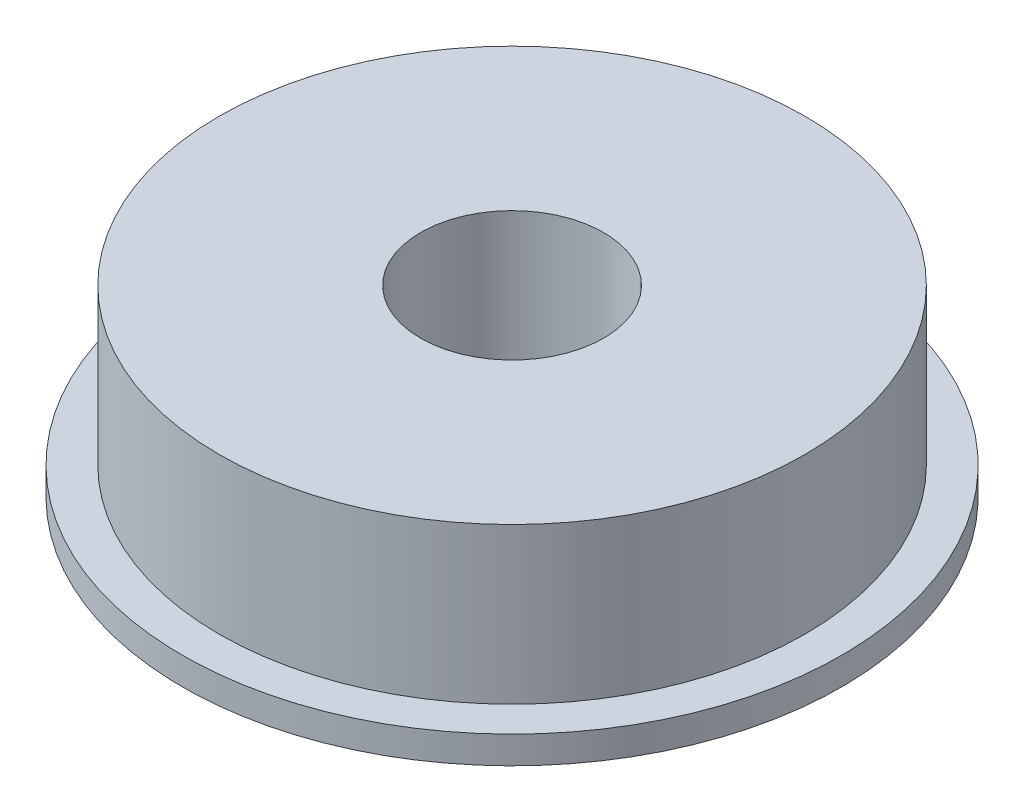
ISO-10303-21;
HEADER;
FILE_DESCRIPTION(('STEP AP214'),'2;1');
FILE_NAME('part.step','',(''),(''),'','','');
FILE_SCHEMA(('AUTOMOTIVE_DESIGN { 1 0 10303 214 1 1 1 1 }'));
ENDSEC;
DATA;
#1=APPLICATION_CONTEXT('core data for automotive mechanical design processes');
#2=APPLICATION_PROTOCOL_DEFINITION('international standard','automotive_design',2000,#1);
#3=PRODUCT_CONTEXT('',#1,'mechanical');
#4=PRODUCT('Part','Part','',(#3));
#5=PRODUCT_RELATED_PRODUCT_CATEGORY('part','',(#4));
#6=PRODUCT_DEFINITION_FORMATION('','',#4);
#7=PRODUCT_DEFINITION_CONTEXT('part definition',#1,'design');
#8=PRODUCT_DEFINITION('design','',#6,#7);
#9=PRODUCT_DEFINITION_SHAPE('','',#8);
#10=(LENGTH_UNIT() NAMED_UNIT(*) SI_UNIT(.MILLI.,.METRE.));
#11=(NAMED_UNIT(*) PLANE_ANGLE_UNIT() SI_UNIT($,.RADIAN.));
#12=(NAMED_UNIT(*) SI_UNIT($,.STERADIAN.) SOLID_ANGLE_UNIT());
#13=UNCERTAINTY_MEASURE_WITH_UNIT(LENGTH_MEASURE(1.E-05),#10,'distance_accuracy_value','');
#14=(GEOMETRIC_REPRESENTATION_CONTEXT(3) GLOBAL_UNCERTAINTY_ASSIGNED_CONTEXT((#13)) GLOBAL_UNIT_ASSIGNED_CONTEXT((#10,
#11,#12)) REPRESENTATION_CONTEXT('',''));
#15=CARTESIAN_POINT('',(0.,0.,0.));
#16=DIRECTION('',(0.,0.,1.));
#17=DIRECTION('',(1.,0.,0.));
#18=AXIS2_PLACEMENT_3D('',#15,#16,#17);
#19=CARTESIAN_POINT('',(0.,0.,-9.00000000000001));
#20=DIRECTION('',(0.,-1.,0.));
#21=DIRECTION('',(0.,0.,-1.));
#22=AXIS2_PLACEMENT_3D('',#19,#20,#21);
#23=PLANE('',#22);
#24=CARTESIAN_POINT('',(0.,0.,0.));
#25=DIRECTION('',(0.,1.,0.));
#26=DIRECTION('',(0.,0.,1.));
#27=AXIS2_PLACEMENT_3D('',#24,#25,#26);
#28=CIRCLE('',#27,2.5);
#29=CARTESIAN_POINT('',(0.,0.,2.5));
#30=VERTEX_POINT('',#29);
#31=EDGE_CURVE('E50',#30,#30,#28,.T.);
#32=ORIENTED_EDGE('',*,*,#31,.T.);
#33=EDGE_LOOP('',(#32));
#34=FACE_BOUND('',#33,.T.);
#35=CARTESIAN_POINT('',(0.,0.,0.));
#36=DIRECTION('',(0.,-1.,0.));
#37=DIRECTION('',(0.,0.,-1.));
#38=AXIS2_PLACEMENT_3D('',#35,#36,#37);
#39=CIRCLE('',#38,9.00000000000001);
#40=CARTESIAN_POINT('',(0.,0.,-9.00000000000001));
#41=VERTEX_POINT('',#40);
#42=EDGE_CURVE('E45',#41,#41,#39,.T.);
#43=ORIENTED_EDGE('',*,*,#42,.T.);
#44=EDGE_LOOP('',(#43));
#45=FACE_BOUND('',#44,.T.);
#46=ADVANCED_FACE('F31',(#34,#45),#23,.T.);
#47=CARTESIAN_POINT('',(0.,5.,0.));
#48=DIRECTION('',(0.,1.,0.));
#49=DIRECTION('',(0.,0.,1.));
#50=AXIS2_PLACEMENT_3D('',#47,#48,#49);
#51=PLANE('',#50);
#52=CARTESIAN_POINT('',(0.,5.,0.));
#53=DIRECTION('',(0.,1.,0.));
#54=DIRECTION('',(0.,0.,1.));
#55=AXIS2_PLACEMENT_3D('',#52,#53,#54);
#56=CIRCLE('',#55,2.5);
#57=CARTESIAN_POINT('',(0.,5.,2.5));
#58=VERTEX_POINT('',#57);
#59=EDGE_CURVE('E51',#58,#58,#56,.T.);
#60=ORIENTED_EDGE('',*,*,#59,.F.);
#61=EDGE_LOOP('',(#60));
#62=FACE_BOUND('',#61,.T.);
#63=CARTESIAN_POINT('',(0.,5.,0.));
#64=DIRECTION('',(0.,-1.,0.));
#65=DIRECTION('',(0.,0.,-1.));
#66=AXIS2_PLACEMENT_3D('',#63,#64,#65);
#67=CIRCLE('',#66,8.00000000000001);
#68=CARTESIAN_POINT('',(0.,5.,-8.00000000000001));
#69=VERTEX_POINT('',#68);
#70=EDGE_CURVE('E10',#69,#69,#67,.T.);
#71=ORIENTED_EDGE('',*,*,#70,.F.);
#72=EDGE_LOOP('',(#71));
#73=FACE_BOUND('',#72,.T.);
#74=ADVANCED_FACE('F66',(#62,#73),#51,.T.);
#75=CARTESIAN_POINT('',(0.,0.,0.));
#76=DIRECTION('',(0.,-1.,0.));
#77=DIRECTION('',(0.,0.,-1.));
#78=AXIS2_PLACEMENT_3D('',#75,#76,#77);
#79=CYLINDRICAL_SURFACE('',#78,8.);
#80=ORIENTED_EDGE('',*,*,#70,.T.);
#81=EDGE_LOOP('',(#80));
#82=FACE_BOUND('',#81,.T.);
#83=CARTESIAN_POINT('',(0.,0.750000000000001,0.));
#84=DIRECTION('',(0.,-1.,0.));
#85=DIRECTION('',(0.,0.,-1.));
#86=AXIS2_PLACEMENT_3D('',#83,#84,#85);
#87=CIRCLE('',#86,8.);
#88=CARTESIAN_POINT('',(0.,0.750000000000001,-8.));
#89=VERTEX_POINT('',#88);
#90=EDGE_CURVE('E37',#89,#89,#87,.T.);
#91=ORIENTED_EDGE('',*,*,#90,.F.);
#92=EDGE_LOOP('',(#91));
#93=FACE_BOUND('',#92,.T.);
#94=ADVANCED_FACE('F69',(#82,#93),#79,.T.);
#95=CARTESIAN_POINT('',(0.,0.750000000000001,-8.));
#96=DIRECTION('',(0.,1.,0.));
#97=DIRECTION('',(0.,0.,1.));
#98=AXIS2_PLACEMENT_3D('',#95,#96,#97);
#99=PLANE('',#98);
#100=ORIENTED_EDGE('',*,*,#90,.T.);
#101=EDGE_LOOP('',(#100));
#102=FACE_BOUND('',#101,.T.);
#103=CARTESIAN_POINT('',(0.,0.750000000000001,0.));
#104=DIRECTION('',(0.,-1.,0.));
#105=DIRECTION('',(0.,0.,-1.));
#106=AXIS2_PLACEMENT_3D('',#103,#104,#105);
#107=CIRCLE('',#106,9.);
#108=CARTESIAN_POINT('',(0.,0.750000000000001,-9.));
#109=VERTEX_POINT('',#108);
#110=EDGE_CURVE('E41',#109,#109,#107,.T.);
#111=ORIENTED_EDGE('',*,*,#110,.F.);
#112=EDGE_LOOP('',(#111));
#113=FACE_BOUND('',#112,.T.);
#114=ADVANCED_FACE('F74',(#102,#113),#99,.T.);
#115=CARTESIAN_POINT('',(0.,0.,0.));
#116=DIRECTION('',(0.,-1.,0.));
#117=DIRECTION('',(0.,0.,-1.));
#118=AXIS2_PLACEMENT_3D('',#115,#116,#117);
#119=CYLINDRICAL_SURFACE('',#118,9.00000000000001);
#120=ORIENTED_EDGE('',*,*,#110,.T.);
#121=EDGE_LOOP('',(#120));
#122=FACE_BOUND('',#121,.T.);
#123=ORIENTED_EDGE('',*,*,#42,.F.);
#124=EDGE_LOOP('',(#123));
#125=FACE_BOUND('',#124,.T.);
#126=ADVANCED_FACE('F62',(#122,#125),#119,.T.);
#127=CARTESIAN_POINT('',(0.,0.,0.));
#128=DIRECTION('',(0.,1.,0.));
#129=DIRECTION('',(0.,0.,1.));
#130=AXIS2_PLACEMENT_3D('',#127,#128,#129);
#131=CYLINDRICAL_SURFACE('',#130,2.5);
#132=ORIENTED_EDGE('',*,*,#31,.F.);
#133=EDGE_LOOP('',(#132));
#134=FACE_BOUND('',#133,.T.);
#135=ORIENTED_EDGE('',*,*,#59,.T.);
#136=EDGE_LOOP('',(#135));
#137=FACE_BOUND('',#136,.T.);
#138=ADVANCED_FACE('F59',(#134,#137),#131,.F.);
#139=CLOSED_SHELL('',(#46,#74,#94,#114,#126,#138));
#140=MANIFOLD_SOLID_BREP('B2',#139);
#141=ADVANCED_BREP_SHAPE_REPRESENTATION('',(#18,#140),#14);
#142=SHAPE_DEFINITION_REPRESENTATION(#9,#141);
ENDSEC;
END-ISO-10303-21;
